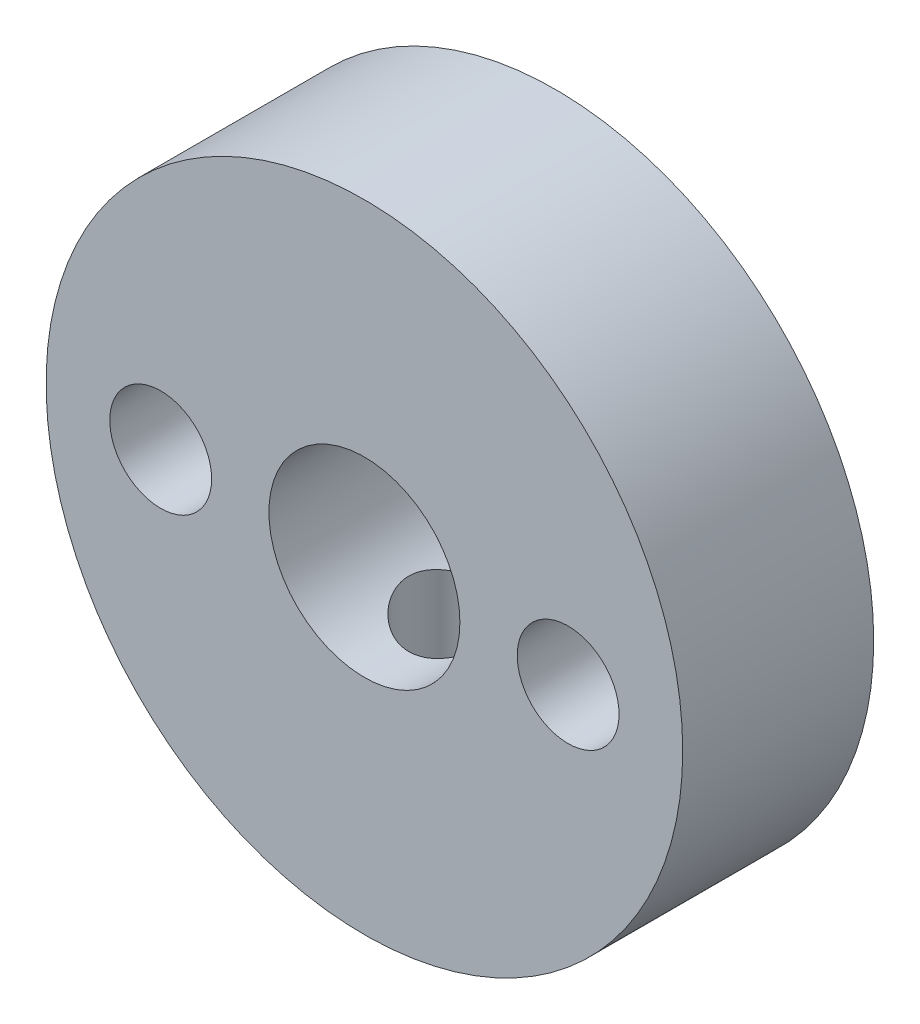
ISO-10303-21;
HEADER;
FILE_DESCRIPTION(('STEP AP214'),'2;1');
FILE_NAME('part.step','',(''),(''),'','','');
FILE_SCHEMA(('AUTOMOTIVE_DESIGN { 1 0 10303 214 1 1 1 1 }'));
ENDSEC;
DATA;
#1=APPLICATION_CONTEXT('core data for automotive mechanical design processes');
#2=APPLICATION_PROTOCOL_DEFINITION('international standard','automotive_design',2000,#1);
#3=PRODUCT_CONTEXT('',#1,'mechanical');
#4=PRODUCT('Part','Part','',(#3));
#5=PRODUCT_RELATED_PRODUCT_CATEGORY('part','',(#4));
#6=PRODUCT_DEFINITION_FORMATION('','',#4);
#7=PRODUCT_DEFINITION_CONTEXT('part definition',#1,'design');
#8=PRODUCT_DEFINITION('design','',#6,#7);
#9=PRODUCT_DEFINITION_SHAPE('','',#8);
#10=(LENGTH_UNIT() NAMED_UNIT(*) SI_UNIT(.MILLI.,.METRE.));
#11=(NAMED_UNIT(*) PLANE_ANGLE_UNIT() SI_UNIT($,.RADIAN.));
#12=(NAMED_UNIT(*) SI_UNIT($,.STERADIAN.) SOLID_ANGLE_UNIT());
#13=UNCERTAINTY_MEASURE_WITH_UNIT(LENGTH_MEASURE(1.E-05),#10,'distance_accuracy_value','');
#14=(GEOMETRIC_REPRESENTATION_CONTEXT(3) GLOBAL_UNCERTAINTY_ASSIGNED_CONTEXT((#13)) GLOBAL_UNIT_ASSIGNED_CONTEXT((#10,
#11,#12)) REPRESENTATION_CONTEXT('',''));
#15=CARTESIAN_POINT('',(0.,0.,0.));
#16=DIRECTION('',(0.,0.,1.));
#17=DIRECTION('',(1.,0.,0.));
#18=AXIS2_PLACEMENT_3D('',#15,#16,#17);
#19=CARTESIAN_POINT('',(0.,0.,1.5));
#20=DIRECTION('',(0.,0.,1.));
#21=DIRECTION('',(1.,0.,0.));
#22=AXIS2_PLACEMENT_3D('',#19,#20,#21);
#23=PLANE('',#22);
#24=CARTESIAN_POINT('',(-3.2,0.,1.5));
#25=DIRECTION('',(0.,0.,1.));
#26=DIRECTION('',(1.,0.,0.));
#27=AXIS2_PLACEMENT_3D('',#24,#25,#26);
#28=CIRCLE('',#27,0.8);
#29=CARTESIAN_POINT('',(-2.4,0.,1.5));
#30=VERTEX_POINT('',#29);
#31=EDGE_CURVE('E74',#30,#30,#28,.T.);
#32=ORIENTED_EDGE('',*,*,#31,.F.);
#33=EDGE_LOOP('',(#32));
#34=FACE_BOUND('',#33,.T.);
#35=CARTESIAN_POINT('',(3.20000000000036,0.,1.5));
#36=DIRECTION('',(0.,0.,1.));
#37=DIRECTION('',(1.,0.,0.));
#38=AXIS2_PLACEMENT_3D('',#35,#36,#37);
#39=CIRCLE('',#38,0.800000000000452);
#40=CARTESIAN_POINT('',(4.00000000000081,0.,1.5));
#41=VERTEX_POINT('',#40);
#42=EDGE_CURVE('E75',#41,#41,#39,.T.);
#43=ORIENTED_EDGE('',*,*,#42,.F.);
#44=EDGE_LOOP('',(#43));
#45=FACE_BOUND('',#44,.T.);
#46=CARTESIAN_POINT('',(0.,0.,1.5));
#47=DIRECTION('',(0.,0.,1.));
#48=DIRECTION('',(1.,0.,0.));
#49=AXIS2_PLACEMENT_3D('',#46,#47,#48);
#50=CIRCLE('',#49,5.);
#51=CARTESIAN_POINT('',(5.,0.,1.5));
#52=VERTEX_POINT('',#51);
#53=EDGE_CURVE('E12',#52,#52,#50,.T.);
#54=ORIENTED_EDGE('',*,*,#53,.T.);
#55=EDGE_LOOP('',(#54));
#56=FACE_BOUND('',#55,.T.);
#57=CARTESIAN_POINT('',(0.,0.,1.5));
#58=DIRECTION('',(0.,0.,1.));
#59=DIRECTION('',(1.,0.,0.));
#60=AXIS2_PLACEMENT_3D('',#57,#58,#59);
#61=CIRCLE('',#60,1.5);
#62=CARTESIAN_POINT('',(1.5,0.,1.5));
#63=VERTEX_POINT('',#62);
#64=EDGE_CURVE('E63',#63,#63,#61,.T.);
#65=ORIENTED_EDGE('',*,*,#64,.F.);
#66=EDGE_LOOP('',(#65));
#67=FACE_BOUND('',#66,.T.);
#68=ADVANCED_FACE('F45',(#34,#45,#56,#67),#23,.T.);
#69=CARTESIAN_POINT('',(0.,0.,-1.5));
#70=DIRECTION('',(0.,0.,1.));
#71=DIRECTION('',(1.,0.,0.));
#72=AXIS2_PLACEMENT_3D('',#69,#70,#71);
#73=PLANE('',#72);
#74=CARTESIAN_POINT('',(-3.2,0.,-1.5));
#75=DIRECTION('',(0.,0.,1.));
#76=DIRECTION('',(1.,0.,0.));
#77=AXIS2_PLACEMENT_3D('',#74,#75,#76);
#78=CIRCLE('',#77,0.8);
#79=CARTESIAN_POINT('',(-2.4,0.,-1.5));
#80=VERTEX_POINT('',#79);
#81=EDGE_CURVE('E68',#80,#80,#78,.T.);
#82=ORIENTED_EDGE('',*,*,#81,.T.);
#83=EDGE_LOOP('',(#82));
#84=FACE_BOUND('',#83,.T.);
#85=CARTESIAN_POINT('',(3.20000000000036,0.,-1.5));
#86=DIRECTION('',(0.,0.,1.));
#87=DIRECTION('',(1.,0.,0.));
#88=AXIS2_PLACEMENT_3D('',#85,#86,#87);
#89=CIRCLE('',#88,0.800000000000452);
#90=CARTESIAN_POINT('',(4.00000000000081,0.,-1.5));
#91=VERTEX_POINT('',#90);
#92=EDGE_CURVE('E71',#91,#91,#89,.T.);
#93=ORIENTED_EDGE('',*,*,#92,.T.);
#94=EDGE_LOOP('',(#93));
#95=FACE_BOUND('',#94,.T.);
#96=CARTESIAN_POINT('',(0.,0.,-1.5));
#97=DIRECTION('',(0.,0.,1.));
#98=DIRECTION('',(1.,0.,0.));
#99=AXIS2_PLACEMENT_3D('',#96,#97,#98);
#100=CIRCLE('',#99,5.);
#101=CARTESIAN_POINT('',(5.,0.,-1.5));
#102=VERTEX_POINT('',#101);
#103=EDGE_CURVE('E58',#102,#102,#100,.T.);
#104=ORIENTED_EDGE('',*,*,#103,.F.);
#105=EDGE_LOOP('',(#104));
#106=FACE_BOUND('',#105,.T.);
#107=CARTESIAN_POINT('',(0.,0.,-1.5));
#108=DIRECTION('',(0.,0.,1.));
#109=DIRECTION('',(1.,0.,0.));
#110=AXIS2_PLACEMENT_3D('',#107,#108,#109);
#111=CIRCLE('',#110,1.5);
#112=CARTESIAN_POINT('',(1.5,0.,-1.5));
#113=VERTEX_POINT('',#112);
#114=EDGE_CURVE('E65',#113,#113,#111,.T.);
#115=ORIENTED_EDGE('',*,*,#114,.T.);
#116=EDGE_LOOP('',(#115));
#117=FACE_BOUND('',#116,.T.);
#118=ADVANCED_FACE('F105',(#84,#95,#106,#117),#73,.F.);
#119=CARTESIAN_POINT('',(0.,0.,1.5));
#120=DIRECTION('',(0.,0.,-1.));
#121=DIRECTION('',(-1.,0.,0.));
#122=AXIS2_PLACEMENT_3D('',#119,#120,#121);
#123=CYLINDRICAL_SURFACE('',#122,5.);
#124=CARTESIAN_POINT('',(0.,-5.,0.8));
#125=CARTESIAN_POINT('',(0.0446308080511735,-4.99999925368398,0.799998188547929));
#126=CARTESIAN_POINT('',(0.0892866095441337,-4.99939618705492,0.796252557082737));
#127=CARTESIAN_POINT('',(0.177347511863295,-4.99704849367426,0.781374220920808));
#128=CARTESIAN_POINT('',(0.220751394454069,-4.99530279172417,0.770234558439943));
#129=CARTESIAN_POINT('',(0.305021508450515,-4.99086578560516,0.740911647821596));
#130=CARTESIAN_POINT('',(0.345889721177602,-4.98817523095935,0.722733981551684));
#131=CARTESIAN_POINT('',(0.423990337738185,-4.98214495920462,0.679865282240887));
#132=CARTESIAN_POINT('',(0.461223193179573,-4.97880532288341,0.655175059646547));
#133=CARTESIAN_POINT('',(0.531330998418697,-4.97181457161351,0.599749758295029));
#134=CARTESIAN_POINT('',(0.564169146610388,-4.96816120177215,0.568968408421934));
#135=CARTESIAN_POINT('',(0.624237641135132,-4.96097215963753,0.502334213090013));
#136=CARTESIAN_POINT('',(0.651467646762836,-4.95743649450599,0.46648105973253));
#137=CARTESIAN_POINT('',(0.699692661652856,-4.95086133431278,0.390470445539172));
#138=CARTESIAN_POINT('',(0.720651599384386,-4.94782475339399,0.350289825055358));
#139=CARTESIAN_POINT('',(0.755508923850426,-4.9426226637982,0.266921734852478));
#140=CARTESIAN_POINT('',(0.769407749272036,-4.94045710100136,0.223734452145011));
#141=CARTESIAN_POINT('',(0.78963503472531,-4.93726457896945,0.135967849254073));
#142=CARTESIAN_POINT('',(0.796026817801601,-4.93622810120145,0.0914034756199899));
#143=CARTESIAN_POINT('',(0.801254845350307,-4.93538226863644,0.00182360516582412));
#144=CARTESIAN_POINT('',(0.80009158277677,-4.93557283377695,-0.0431918620298017));
#145=CARTESIAN_POINT('',(0.790294188232538,-4.93715085922415,-0.131946012199574));
#146=CARTESIAN_POINT('',(0.781730938905658,-4.93852696316707,-0.175692750944416));
#147=CARTESIAN_POINT('',(0.757487774055362,-4.94230325280695,-0.261120428439184));
#148=CARTESIAN_POINT('',(0.741807631982687,-4.944703471104,-0.30280130138036));
#149=CARTESIAN_POINT('',(0.703703154988826,-4.9502699273064,-0.383127707142341));
#150=CARTESIAN_POINT('',(0.681249143270038,-4.95343952372276,-0.421758919874151));
#151=CARTESIAN_POINT('',(0.630255410529451,-4.96018523245969,-0.494732108674134));
#152=CARTESIAN_POINT('',(0.601715236062147,-4.96376137506045,-0.529073764849275));
#153=CARTESIAN_POINT('',(0.538971936351568,-4.97096724981016,-0.592903520174938));
#154=CARTESIAN_POINT('',(0.504707942182396,-4.97459712801084,-0.622331802827516));
#155=CARTESIAN_POINT('',(0.431696149872209,-4.98146370833866,-0.675029895537204));
#156=CARTESIAN_POINT('',(0.392948326886552,-4.98470040828701,-0.698299671468029));
#157=CARTESIAN_POINT('',(0.312014355323648,-4.99042002279776,-0.738024671245593));
#158=CARTESIAN_POINT('',(0.269825706968612,-4.99290238302826,-0.754474886907546));
#159=CARTESIAN_POINT('',(0.183235933575908,-4.9968291023744,-0.780039743170405));
#160=CARTESIAN_POINT('',(0.138834979228292,-4.99827354143846,-0.789154948774827));
#161=CARTESIAN_POINT('',(0.0495968221607879,-4.99995098582024,-0.799710588005183));
#162=CARTESIAN_POINT('',(0.00476957346417526,-5.00019695987027,-0.801233186383065));
#163=CARTESIAN_POINT('',(-0.0844997486044572,-4.99948519003732,-0.796779047356295));
#164=CARTESIAN_POINT('',(-0.128941835541715,-4.9985274887222,-0.790802575155461));
#165=CARTESIAN_POINT('',(-0.215927519294203,-4.99552400060935,-0.771588280724304));
#166=CARTESIAN_POINT('',(-0.258480269760833,-4.99348427121022,-0.758390869878181));
#167=CARTESIAN_POINT('',(-0.340769196234398,-4.98854458459104,-0.725152212587981));
#168=CARTESIAN_POINT('',(-0.380505224396477,-4.98564458225813,-0.705110607224762));
#169=CARTESIAN_POINT('',(-0.456391460451548,-4.9792740860737,-0.658562400278675));
#170=CARTESIAN_POINT('',(-0.492509601238282,-4.97579911023324,-0.632004145590771));
#171=CARTESIAN_POINT('',(-0.559805662558114,-4.96867838165483,-0.573247938254995));
#172=CARTESIAN_POINT('',(-0.590983253761131,-4.96503261755335,-0.541049609948698));
#173=CARTESIAN_POINT('',(-0.647815466120003,-4.95793961092294,-0.471559844758417));
#174=CARTESIAN_POINT('',(-0.67341474965888,-4.95449458581512,-0.434222888485272));
#175=CARTESIAN_POINT('',(-0.717977956840479,-4.94823364120698,-0.355730487551866));
#176=CARTESIAN_POINT('',(-0.736942078495341,-4.94541770293382,-0.31457515688916));
#177=CARTESIAN_POINT('',(-0.767612633416616,-4.94075016481912,-0.229773216312714));
#178=CARTESIAN_POINT('',(-0.779347259610064,-4.9388948235089,-0.186137018160853));
#179=CARTESIAN_POINT('',(-0.795314874217839,-4.93634892888289,-0.0974809720031941));
#180=CARTESIAN_POINT('',(-0.799548458993818,-4.93565828296954,-0.052461234283664));
#181=CARTESIAN_POINT('',(-0.800378186473576,-4.93552375034277,0.0371317973746485));
#182=CARTESIAN_POINT('',(-0.797061391285785,-4.93606565128661,0.0817042878159049));
#183=CARTESIAN_POINT('',(-0.7830720718919,-4.93830411303284,0.169648529050891));
#184=CARTESIAN_POINT('',(-0.772399566311448,-4.9400006709115,0.213020282884757));
#185=CARTESIAN_POINT('',(-0.744034087420252,-4.94435206344804,0.297302140006588));
#186=CARTESIAN_POINT('',(-0.726348031080534,-4.94700595372412,0.338214623056527));
#187=CARTESIAN_POINT('',(-0.684466309136974,-4.95297399069632,0.416505787069229));
#188=CARTESIAN_POINT('',(-0.660270362498029,-4.95628816589566,0.453884315375293));
#189=CARTESIAN_POINT('',(-0.605742654398707,-4.96324867230805,0.524487432334617));
#190=CARTESIAN_POINT('',(-0.575346658323836,-4.96689824087121,0.557662099160166));
#191=CARTESIAN_POINT('',(-0.50941733743181,-4.97409200519902,0.618470152559009));
#192=CARTESIAN_POINT('',(-0.473882825608017,-4.97763617638799,0.646102255259484));
#193=CARTESIAN_POINT('',(-0.398419338630932,-4.98424562251661,0.695198986468726));
#194=CARTESIAN_POINT('',(-0.358464019917938,-4.98730773061183,0.71662354955496));
#195=CARTESIAN_POINT('',(-0.275490066787461,-4.99257715001872,0.752424517159631));
#196=CARTESIAN_POINT('',(-0.232474584483901,-4.99478532624932,0.76680805724159));
#197=CARTESIAN_POINT('',(-0.157734207535215,-4.99760702358556,0.78493829549419));
#198=CARTESIAN_POINT('',(-0.126465390999476,-4.9984996711327,0.79057756111712));
#199=CARTESIAN_POINT('',(-0.0634685920606806,-4.99969642026856,0.798109029145443));
#200=CARTESIAN_POINT('',(-0.0317406166155305,-5.00000053076634,0.800001288271672));
#201=CARTESIAN_POINT('',(0.,-5.,0.8));
#202=B_SPLINE_CURVE_WITH_KNOTS('',3,(#124,#125,#126,#127,#128,#129,#130,#131,#132,#133,#134,
#135,#136,#137,#138,#139,#140,#141,#142,#143,#144,#145,#146,#147,#148,#149,#150,#151,#152,#153,
#154,#155,#156,#157,#158,#159,#160,#161,#162,#163,#164,#165,#166,#167,#168,#169,#170,#171,#172,
#173,#174,#175,#176,#177,#178,#179,#180,#181,#182,#183,#184,#185,#186,#187,#188,#189,#190,#191,
#192,#193,#194,#195,#196,#197,#198,#199,#200,#201),.UNSPECIFIED.,.T.,.F.,(4,2,2,2,2,2,2,2,2,2,2,
2,2,2,2,2,2,2,2,2,2,2,2,2,2,2,2,2,2,2,2,2,2,2,2,2,2,2,4),(0.,0.133776418649178,
0.267678899727787,0.401475399062741,0.535255256116415,0.670093338432935,0.804939610005121,
0.940547238503781,1.07614643985655,1.2105934338786,1.3450316555481,1.478196223562,
1.61136503084877,1.74512594827327,1.87889683494994,2.01419325334956,2.14949042145488,
2.28488677454408,2.42027269728078,2.55419028860046,2.68810314407254,2.82127412090819,
2.95445208248902,3.08872183713538,3.22300053825308,3.35855610834642,3.49410763273008,
3.62912714304126,3.76413591830011,3.89759582738457,4.03105539853193,4.16438367394704,
4.29771770613194,4.43251052341619,4.56733452797894,4.70301027460094,4.83854823761406,
4.93368902667994,5.0288283755278),.UNSPECIFIED.);
#203=CARTESIAN_POINT('',(0.,-5.,0.8));
#204=VERTEX_POINT('',#203);
#205=EDGE_CURVE('E78',#204,#204,#202,.T.);
#206=ORIENTED_EDGE('',*,*,#205,.T.);
#207=EDGE_LOOP('',(#206));
#208=FACE_BOUND('',#207,.T.);
#209=ORIENTED_EDGE('',*,*,#53,.F.);
#210=EDGE_LOOP('',(#209));
#211=FACE_BOUND('',#210,.T.);
#212=ORIENTED_EDGE('',*,*,#103,.T.);
#213=EDGE_LOOP('',(#212));
#214=FACE_BOUND('',#213,.T.);
#215=ADVANCED_FACE('F47',(#208,#211,#214),#123,.T.);
#216=CARTESIAN_POINT('',(0.,0.,1.5));
#217=DIRECTION('',(0.,0.,-1.));
#218=DIRECTION('',(-1.,0.,0.));
#219=AXIS2_PLACEMENT_3D('',#216,#217,#218);
#220=CYLINDRICAL_SURFACE('',#219,1.5);
#221=CARTESIAN_POINT('',(0.,-1.5,0.8));
#222=CARTESIAN_POINT('',(0.041714004293709,-1.49999758414449,0.79999729171022));
#223=CARTESIAN_POINT('',(0.0834672912539168,-1.49824189360224,0.796718403587561));
#224=CARTESIAN_POINT('',(0.165718197334509,-1.49139129667971,0.783758299133951));
#225=CARTESIAN_POINT('',(0.206213769841148,-1.48629121869364,0.774067166996487));
#226=CARTESIAN_POINT('',(0.284638594945811,-1.47328036800654,0.748780160141689));
#227=CARTESIAN_POINT('',(0.322577512237572,-1.46538097991501,0.733208185810114));
#228=CARTESIAN_POINT('',(0.395235474229212,-1.4474774987237,0.696737448288011));
#229=CARTESIAN_POINT('',(0.429954504316264,-1.43747339607276,0.675838660924399));
#230=CARTESIAN_POINT('',(0.497767319459639,-1.41547900666031,0.627748438268247));
#231=CARTESIAN_POINT('',(0.530602027463185,-1.4034011481073,0.60023239648025));
#232=CARTESIAN_POINT('',(0.591434030661653,-1.37887042167267,0.540396854313251));
#233=CARTESIAN_POINT('',(0.619427089896366,-1.36641723648963,0.508073193266347));
#234=CARTESIAN_POINT('',(0.672354419511099,-1.34122140682262,0.436021941522241));
#235=CARTESIAN_POINT('',(0.696776837026744,-1.32855595701366,0.395887951336953));
#236=CARTESIAN_POINT('',(0.738426416316996,-1.30586838669548,0.311354318648837));
#237=CARTESIAN_POINT('',(0.755659138193531,-1.29584422578236,0.266958005193252));
#238=CARTESIAN_POINT('',(0.781243551670882,-1.28057394848523,0.177945730638708));
#239=CARTESIAN_POINT('',(0.790083117424791,-1.27506829565278,0.13351702790959));
#240=CARTESIAN_POINT('',(0.800094972405448,-1.26881331156942,0.0434961280342448));
#241=CARTESIAN_POINT('',(0.801276946959554,-1.26805797215382,-0.00209452613423204));
#242=CARTESIAN_POINT('',(0.796296021649253,-1.27118648805135,-0.0862218656466407));
#243=CARTESIAN_POINT('',(0.791143222976706,-1.2744325135639,-0.124848446622228));
#244=CARTESIAN_POINT('',(0.775413455073683,-1.28406317281932,-0.200574623942005));
#245=CARTESIAN_POINT('',(0.764834303757537,-1.29044906914779,-0.237673599505729));
#246=CARTESIAN_POINT('',(0.738390252390663,-1.30576277857079,-0.310338026573563));
#247=CARTESIAN_POINT('',(0.722411944930874,-1.31474447400447,-0.345850303085015));
#248=CARTESIAN_POINT('',(0.685716522966988,-1.3342504708289,-0.413869526357397));
#249=CARTESIAN_POINT('',(0.664997308543691,-1.34477545505385,-0.446375132369022));
#250=CARTESIAN_POINT('',(0.615868522436844,-1.36804524940245,-0.512485861213274));
#251=CARTESIAN_POINT('',(0.586776291159892,-1.38088899493241,-0.545550735246708));
#252=CARTESIAN_POINT('',(0.523451373374352,-1.40611558623123,-0.606575357689949));
#253=CARTESIAN_POINT('',(0.489215573049462,-1.41849814710228,-0.634531990793125));
#254=CARTESIAN_POINT('',(0.41402207703118,-1.44230010999534,-0.686137714914207));
#255=CARTESIAN_POINT('',(0.372785484410791,-1.45361823088172,-0.70943110819391));
#256=CARTESIAN_POINT('',(0.286226859736144,-1.47310395304255,-0.748547883176902));
#257=CARTESIAN_POINT('',(0.240908517249558,-1.48127436501701,-0.764377932003115));
#258=CARTESIAN_POINT('',(0.151832213955905,-1.4929099561423,-0.78667761240728));
#259=CARTESIAN_POINT('',(0.108300131382031,-1.49673204992477,-0.793860701309987));
#260=CARTESIAN_POINT('',(0.0204895975412033,-1.50050221027202,-0.800947503200433));
#261=CARTESIAN_POINT('',(-0.0237884072844008,-1.50045251716091,-0.80085542580229));
#262=CARTESIAN_POINT('',(-0.107545959760608,-1.49667382258832,-0.793750071169325));
#263=CARTESIAN_POINT('',(-0.147096449267732,-1.49327897244287,-0.787365359251738));
#264=CARTESIAN_POINT('',(-0.224469554831582,-1.48362188327846,-0.768892557902082));
#265=CARTESIAN_POINT('',(-0.262291990687247,-1.47735934596487,-0.756803875143303));
#266=CARTESIAN_POINT('',(-0.336250167522202,-1.46232570811689,-0.727025057531773));
#267=CARTESIAN_POINT('',(-0.372320333376869,-1.4534959496239,-0.709202765081717));
#268=CARTESIAN_POINT('',(-0.441062157410962,-1.43413438081761,-0.668624845698398));
#269=CARTESIAN_POINT('',(-0.473732482002725,-1.42360190671964,-0.645867293623103));
#270=CARTESIAN_POINT('',(-0.538489644606411,-1.40047645695353,-0.59325519889227));
#271=CARTESIAN_POINT('',(-0.570134865108252,-1.38778372966929,-0.56290033267114));
#272=CARTESIAN_POINT('',(-0.628109862741503,-1.36252708549313,-0.497387164084843));
#273=CARTESIAN_POINT('',(-0.654434715474712,-1.34996329805962,-0.462224461707956));
#274=CARTESIAN_POINT('',(-0.70274076630891,-1.32549514327965,-0.385173513824971));
#275=CARTESIAN_POINT('',(-0.724310244689175,-1.31369210729127,-0.342991861220585));
#276=CARTESIAN_POINT('',(-0.759824848176573,-1.29347935062968,-0.25478990991383));
#277=CARTESIAN_POINT('',(-0.773780830369481,-1.28506480237657,-0.208775185878254));
#278=CARTESIAN_POINT('',(-0.792295451806952,-1.27372513461019,-0.118986152902457));
#279=CARTESIAN_POINT('',(-0.797640611545244,-1.27034308682665,-0.0754338162845399));
#280=CARTESIAN_POINT('',(-0.801103834511684,-1.26816359887642,0.0120603141803605));
#281=CARTESIAN_POINT('',(-0.799226824740039,-1.26936303319563,0.0560018221225666));
#282=CARTESIAN_POINT('',(-0.789056350744178,-1.27570247677833,0.137346354858054));
#283=CARTESIAN_POINT('',(-0.781570591370404,-1.28034575552508,0.174894890727509));
#284=CARTESIAN_POINT('',(-0.761493436479322,-1.29238691721072,0.248133957541068));
#285=CARTESIAN_POINT('',(-0.748900147495982,-1.29978582163339,0.283823793884208));
#286=CARTESIAN_POINT('',(-0.718080352112418,-1.3170766557443,0.354904779546557));
#287=CARTESIAN_POINT('',(-0.699543207429632,-1.32709848411839,0.390128567415769));
#288=CARTESIAN_POINT('',(-0.657671226676286,-1.34833960706443,0.457201935759752));
#289=CARTESIAN_POINT('',(-0.634333807313365,-1.35955954483521,0.489049685359359));
#290=CARTESIAN_POINT('',(-0.579583602633468,-1.38387269806828,0.553273093880293));
#291=CARTESIAN_POINT('',(-0.547491018352179,-1.39700212075101,0.585058740448831));
#292=CARTESIAN_POINT('',(-0.47815016455982,-1.42222830059072,0.64297227038809));
#293=CARTESIAN_POINT('',(-0.440898582826824,-1.43432438618419,0.669096491103799));
#294=CARTESIAN_POINT('',(-0.361022002622199,-1.45651015109521,0.715433959936658));
#295=CARTESIAN_POINT('',(-0.318288665753908,-1.4665441059256,0.735488626424893));
#296=CARTESIAN_POINT('',(-0.229399331630396,-1.48303856571174,0.767853622733874));
#297=CARTESIAN_POINT('',(-0.183252846928633,-1.48950860714735,0.780184632122339));
#298=CARTESIAN_POINT('',(-0.113807677907482,-1.49584776109147,0.792192671272072));
#299=CARTESIAN_POINT('',(-0.0911777471195387,-1.49739944315896,0.795114884201634));
#300=CARTESIAN_POINT('',(-0.0457024774465214,-1.49947623062919,0.799019302158529));
#301=CARTESIAN_POINT('',(-0.0228571359907307,-1.50000132376498,0.800001484003966));
#302=CARTESIAN_POINT('',(0.,-1.5,0.8));
#303=B_SPLINE_CURVE_WITH_KNOTS('',3,(#221,#222,#223,#224,#225,#226,#227,#228,#229,#230,#231,
#232,#233,#234,#235,#236,#237,#238,#239,#240,#241,#242,#243,#244,#245,#246,#247,#248,#249,#250,
#251,#252,#253,#254,#255,#256,#257,#258,#259,#260,#261,#262,#263,#264,#265,#266,#267,#268,#269,
#270,#271,#272,#273,#274,#275,#276,#277,#278,#279,#280,#281,#282,#283,#284,#285,#286,#287,#288,
#289,#290,#291,#292,#293,#294,#295,#296,#297,#298,#299,#300,#301,#302),.UNSPECIFIED.,.T.,.F.,(4,
2,2,2,2,2,2,2,2,2,2,2,2,2,2,2,2,2,2,2,2,2,2,2,2,2,2,2,2,2,2,2,2,2,2,2,2,2,2,2,4),(0.,
0.125049785968992,0.250293400579707,0.375033395431379,0.49977395636337,0.632758937517726,
0.765859685119312,0.911100210896854,1.0562282067719,1.19228300426694,1.32816568589671,
1.44492819552126,1.5617376954166,1.68117137196064,1.80065805275817,1.93770170276478,
2.07482865313357,2.22012229846781,2.3652859036198,2.49740165319181,2.62944095746675,
2.74950324975936,2.86957803367867,2.99264692026345,3.11576390008819,3.2521377258514,
3.38863720347795,3.53432584534744,3.67980618389779,3.81103787448892,3.94218005404205,
4.05738088818269,4.17262446873054,4.29529226385602,4.41802624681408,4.55851375899382,
4.69909188991155,4.84307664846754,4.98667423094967,5.05519428454422,5.12371515689634),.UNSPECIFIED.);
#304=CARTESIAN_POINT('',(0.,-1.5,0.8));
#305=VERTEX_POINT('',#304);
#306=EDGE_CURVE('E50',#305,#305,#303,.T.);
#307=ORIENTED_EDGE('',*,*,#306,.F.);
#308=EDGE_LOOP('',(#307));
#309=FACE_BOUND('',#308,.T.);
#310=ORIENTED_EDGE('',*,*,#64,.T.);
#311=EDGE_LOOP('',(#310));
#312=FACE_BOUND('',#311,.T.);
#313=ORIENTED_EDGE('',*,*,#114,.F.);
#314=EDGE_LOOP('',(#313));
#315=FACE_BOUND('',#314,.T.);
#316=ADVANCED_FACE('F98',(#309,#312,#315),#220,.F.);
#317=CARTESIAN_POINT('',(3.20000000000036,0.,-1.5));
#318=DIRECTION('',(0.,0.,1.));
#319=DIRECTION('',(1.,0.,0.));
#320=AXIS2_PLACEMENT_3D('',#317,#318,#319);
#321=CYLINDRICAL_SURFACE('',#320,0.800000000000452);
#322=ORIENTED_EDGE('',*,*,#92,.F.);
#323=EDGE_LOOP('',(#322));
#324=FACE_BOUND('',#323,.T.);
#325=ORIENTED_EDGE('',*,*,#42,.T.);
#326=EDGE_LOOP('',(#325));
#327=FACE_BOUND('',#326,.T.);
#328=ADVANCED_FACE('F95',(#324,#327),#321,.F.);
#329=CARTESIAN_POINT('',(-3.2,0.,-1.5));
#330=DIRECTION('',(0.,0.,1.));
#331=DIRECTION('',(1.,0.,0.));
#332=AXIS2_PLACEMENT_3D('',#329,#330,#331);
#333=CYLINDRICAL_SURFACE('',#332,0.8);
#334=ORIENTED_EDGE('',*,*,#81,.F.);
#335=EDGE_LOOP('',(#334));
#336=FACE_BOUND('',#335,.T.);
#337=ORIENTED_EDGE('',*,*,#31,.T.);
#338=EDGE_LOOP('',(#337));
#339=FACE_BOUND('',#338,.T.);
#340=ADVANCED_FACE('F90',(#336,#339),#333,.F.);
#341=CARTESIAN_POINT('',(0.,-5.,0.));
#342=DIRECTION('',(0.,1.,0.));
#343=DIRECTION('',(0.,0.,1.));
#344=AXIS2_PLACEMENT_3D('',#341,#342,#343);
#345=CYLINDRICAL_SURFACE('',#344,0.8);
#346=ORIENTED_EDGE('',*,*,#306,.T.);
#347=EDGE_LOOP('',(#346));
#348=FACE_BOUND('',#347,.T.);
#349=ORIENTED_EDGE('',*,*,#205,.F.);
#350=EDGE_LOOP('',(#349));
#351=FACE_BOUND('',#350,.T.);
#352=ADVANCED_FACE('F86',(#348,#351),#345,.F.);
#353=CLOSED_SHELL('',(#68,#118,#215,#316,#328,#340,#352));
#354=MANIFOLD_SOLID_BREP('B2',#353);
#355=ADVANCED_BREP_SHAPE_REPRESENTATION('',(#18,#354),#14);
#356=SHAPE_DEFINITION_REPRESENTATION(#9,#355);
ENDSEC;
END-ISO-10303-21;
